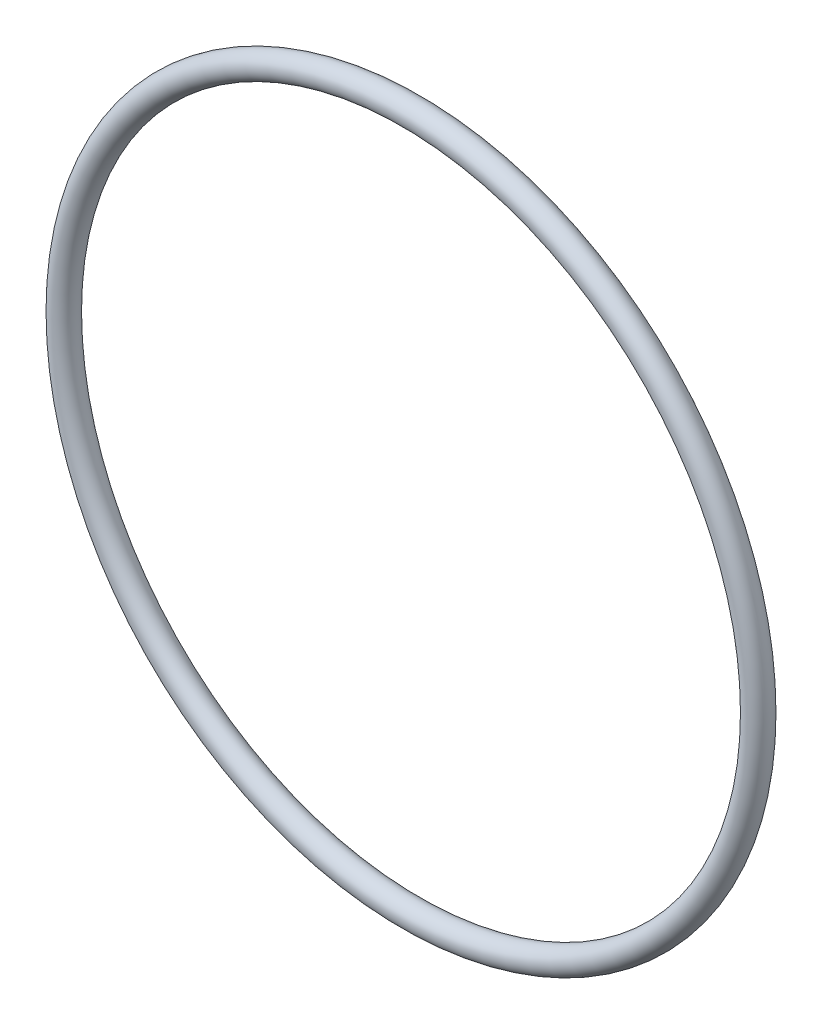
ISO-10303-21;
HEADER;
FILE_DESCRIPTION(('STEP AP214'),'2;1');
FILE_NAME('part.step','',(''),(''),'','','');
FILE_SCHEMA(('AUTOMOTIVE_DESIGN { 1 0 10303 214 1 1 1 1 }'));
ENDSEC;
DATA;
#1=APPLICATION_CONTEXT('core data for automotive mechanical design processes');
#2=APPLICATION_PROTOCOL_DEFINITION('international standard','automotive_design',2000,#1);
#3=PRODUCT_CONTEXT('',#1,'mechanical');
#4=PRODUCT('Part','Part','',(#3));
#5=PRODUCT_RELATED_PRODUCT_CATEGORY('part','',(#4));
#6=PRODUCT_DEFINITION_FORMATION('','',#4);
#7=PRODUCT_DEFINITION_CONTEXT('part definition',#1,'design');
#8=PRODUCT_DEFINITION('design','',#6,#7);
#9=PRODUCT_DEFINITION_SHAPE('','',#8);
#10=(LENGTH_UNIT() NAMED_UNIT(*) SI_UNIT(.MILLI.,.METRE.));
#11=(NAMED_UNIT(*) PLANE_ANGLE_UNIT() SI_UNIT($,.RADIAN.));
#12=(NAMED_UNIT(*) SI_UNIT($,.STERADIAN.) SOLID_ANGLE_UNIT());
#13=UNCERTAINTY_MEASURE_WITH_UNIT(LENGTH_MEASURE(1.E-05),#10,'distance_accuracy_value','');
#14=(GEOMETRIC_REPRESENTATION_CONTEXT(3) GLOBAL_UNCERTAINTY_ASSIGNED_CONTEXT((#13)) GLOBAL_UNIT_ASSIGNED_CONTEXT((#10,
#11,#12)) REPRESENTATION_CONTEXT('',''));
#15=CARTESIAN_POINT('',(0.,0.,0.));
#16=DIRECTION('',(0.,0.,1.));
#17=DIRECTION('',(1.,0.,0.));
#18=AXIS2_PLACEMENT_3D('',#15,#16,#17);
#19=CARTESIAN_POINT('',(0.,0.,0.));
#20=DIRECTION('',(0.,0.,1.));
#21=DIRECTION('',(1.,0.,0.));
#22=AXIS2_PLACEMENT_3D('',#19,#20,#21);
#23=TOROIDAL_SURFACE('',#22,24.5618,0.888999999999996);
#24=CARTESIAN_POINT('',(25.4508,0.,0.));
#25=VERTEX_POINT('',#24);
#26=VERTEX_LOOP('',#25);
#27=FACE_BOUND('',#26,.T.);
#28=ADVANCED_FACE('F33',(#27),#23,.T.);
#29=CLOSED_SHELL('',(#28));
#30=MANIFOLD_SOLID_BREP('B2',#29);
#31=ADVANCED_BREP_SHAPE_REPRESENTATION('',(#18,#30),#14);
#32=SHAPE_DEFINITION_REPRESENTATION(#9,#31);
ENDSEC;
END-ISO-10303-21;
